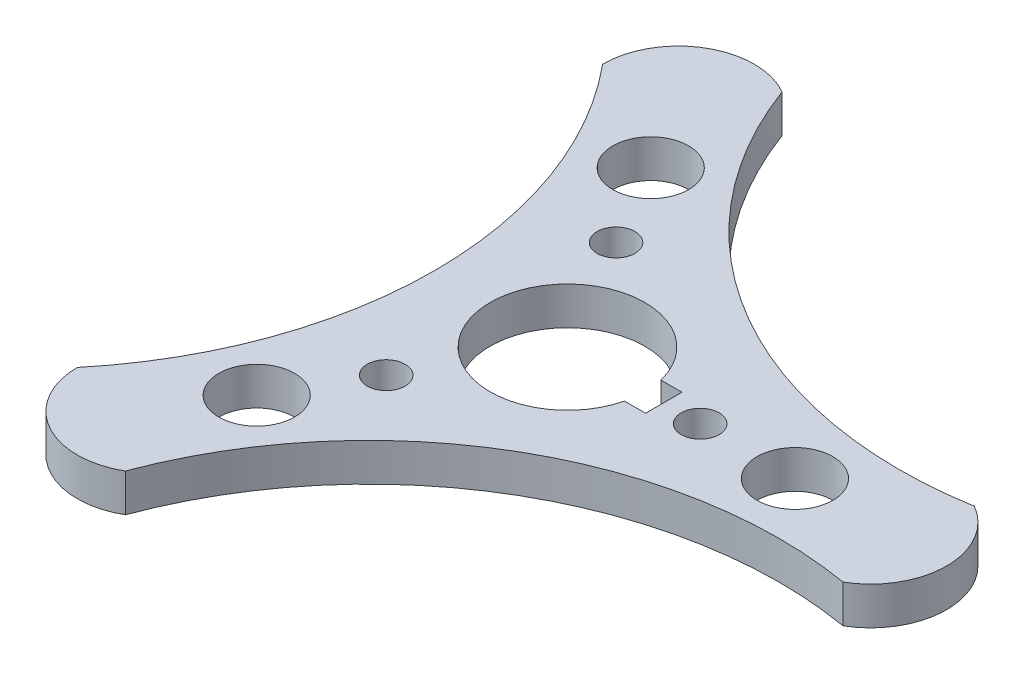
ISO-10303-21;
HEADER;
FILE_DESCRIPTION(('STEP AP214'),'2;1');
FILE_NAME('part.step','',(''),(''),'','','');
FILE_SCHEMA(('AUTOMOTIVE_DESIGN { 1 0 10303 214 1 1 1 1 }'));
ENDSEC;
DATA;
#1=APPLICATION_CONTEXT('core data for automotive mechanical design processes');
#2=APPLICATION_PROTOCOL_DEFINITION('international standard','automotive_design',2000,#1);
#3=PRODUCT_CONTEXT('',#1,'mechanical');
#4=PRODUCT('Part','Part','',(#3));
#5=PRODUCT_RELATED_PRODUCT_CATEGORY('part','',(#4));
#6=PRODUCT_DEFINITION_FORMATION('','',#4);
#7=PRODUCT_DEFINITION_CONTEXT('part definition',#1,'design');
#8=PRODUCT_DEFINITION('design','',#6,#7);
#9=PRODUCT_DEFINITION_SHAPE('','',#8);
#10=(LENGTH_UNIT() NAMED_UNIT(*) SI_UNIT(.MILLI.,.METRE.));
#11=(NAMED_UNIT(*) PLANE_ANGLE_UNIT() SI_UNIT($,.RADIAN.));
#12=(NAMED_UNIT(*) SI_UNIT($,.STERADIAN.) SOLID_ANGLE_UNIT());
#13=UNCERTAINTY_MEASURE_WITH_UNIT(LENGTH_MEASURE(1.E-05),#10,'distance_accuracy_value','');
#14=(GEOMETRIC_REPRESENTATION_CONTEXT(3) GLOBAL_UNCERTAINTY_ASSIGNED_CONTEXT((#13)) GLOBAL_UNIT_ASSIGNED_CONTEXT((#10,
#11,#12)) REPRESENTATION_CONTEXT('',''));
#15=CARTESIAN_POINT('',(0.,0.,0.));
#16=DIRECTION('',(0.,0.,1.));
#17=DIRECTION('',(1.,0.,0.));
#18=AXIS2_PLACEMENT_3D('',#15,#16,#17);
#19=CARTESIAN_POINT('',(-12.7,3.175,21.9970452561247));
#20=DIRECTION('',(0.,-1.,0.));
#21=DIRECTION('',(0.,0.,-1.));
#22=AXIS2_PLACEMENT_3D('',#19,#20,#21);
#23=CYLINDRICAL_SURFACE('',#22,6.35);
#24=CARTESIAN_POINT('',(-12.7,0.,21.9970452561247));
#25=DIRECTION('',(0.,1.,0.));
#26=DIRECTION('',(0.,0.,1.));
#27=AXIS2_PLACEMENT_3D('',#24,#25,#26);
#28=CIRCLE('',#27,6.35);
#29=CARTESIAN_POINT('',(-19.05,0.,21.9970452561247));
#30=VERTEX_POINT('',#29);
#31=CARTESIAN_POINT('',(-9.52499999999993,0.,27.4963065701559));
#32=VERTEX_POINT('',#31);
#33=EDGE_CURVE('E178',#30,#32,#28,.T.);
#34=ORIENTED_EDGE('',*,*,#33,.T.);
#35=DIRECTION('',(0.,-1.,0.));
#36=VECTOR('',#35,1.);
#37=CARTESIAN_POINT('',(-9.52499999999993,3.175,27.4963065701559));
#38=LINE('',#37,#36);
#39=CARTESIAN_POINT('',(-9.52499999999993,3.175,27.4963065701559));
#40=VERTEX_POINT('',#39);
#41=EDGE_CURVE('E11',#40,#32,#38,.T.);
#42=ORIENTED_EDGE('',*,*,#41,.F.);
#43=CARTESIAN_POINT('',(-12.7,3.175,21.9970452561247));
#44=DIRECTION('',(0.,1.,0.));
#45=DIRECTION('',(0.,0.,1.));
#46=AXIS2_PLACEMENT_3D('',#43,#44,#45);
#47=CIRCLE('',#46,6.35);
#48=CARTESIAN_POINT('',(-19.05,3.175,21.9970452561247));
#49=VERTEX_POINT('',#48);
#50=EDGE_CURVE('E306',#49,#40,#47,.T.);
#51=ORIENTED_EDGE('',*,*,#50,.F.);
#52=DIRECTION('',(0.,-1.,0.));
#53=VECTOR('',#52,1.);
#54=CARTESIAN_POINT('',(-19.05,3.175,21.9970452561247));
#55=LINE('',#54,#53);
#56=EDGE_CURVE('E51',#49,#30,#55,.T.);
#57=ORIENTED_EDGE('',*,*,#56,.T.);
#58=EDGE_LOOP('',(#34,#42,#51,#57));
#59=FACE_BOUND('',#58,.T.);
#60=ADVANCED_FACE('F32',(#59),#23,.T.);
#61=CARTESIAN_POINT('',(22.7806250000006,3.175,39.4571999281748));
#62=DIRECTION('',(0.,-1.,0.));
#63=DIRECTION('',(0.,0.,-1.));
#64=AXIS2_PLACEMENT_3D('',#61,#62,#63);
#65=CYLINDRICAL_SURFACE('',#64,34.4487500000009);
#66=CARTESIAN_POINT('',(22.7806250000006,0.,39.4571999281748));
#67=DIRECTION('',(0.,1.,0.));
#68=DIRECTION('',(0.,0.,1.));
#69=AXIS2_PLACEMENT_3D('',#66,#67,#68);
#70=CIRCLE('',#69,34.4487500000009);
#71=CARTESIAN_POINT('',(28.5749999999999,0.,5.49926131403122));
#72=VERTEX_POINT('',#71);
#73=EDGE_CURVE('E180',#32,#72,#70,.F.);
#74=ORIENTED_EDGE('',*,*,#73,.T.);
#75=DIRECTION('',(0.,-1.,0.));
#76=VECTOR('',#75,1.);
#77=CARTESIAN_POINT('',(28.5749999999999,3.175,5.49926131403122));
#78=LINE('',#77,#76);
#79=CARTESIAN_POINT('',(28.5749999999999,3.175,5.49926131403122));
#80=VERTEX_POINT('',#79);
#81=EDGE_CURVE('E42',#80,#72,#78,.T.);
#82=ORIENTED_EDGE('',*,*,#81,.F.);
#83=CARTESIAN_POINT('',(22.7806250000006,3.175,39.4571999281748));
#84=DIRECTION('',(0.,1.,0.));
#85=DIRECTION('',(0.,0.,1.));
#86=AXIS2_PLACEMENT_3D('',#83,#84,#85);
#87=CIRCLE('',#86,34.4487500000009);
#88=EDGE_CURVE('E142',#40,#80,#87,.F.);
#89=ORIENTED_EDGE('',*,*,#88,.F.);
#90=ORIENTED_EDGE('',*,*,#41,.T.);
#91=EDGE_LOOP('',(#74,#82,#89,#90));
#92=FACE_BOUND('',#91,.T.);
#93=ADVANCED_FACE('F247',(#92),#65,.F.);
#94=CARTESIAN_POINT('',(25.4,3.175,0.));
#95=DIRECTION('',(0.,-1.,0.));
#96=DIRECTION('',(0.,0.,-1.));
#97=AXIS2_PLACEMENT_3D('',#94,#95,#96);
#98=CYLINDRICAL_SURFACE('',#97,6.35);
#99=CARTESIAN_POINT('',(25.4,0.,0.));
#100=DIRECTION('',(0.,1.,0.));
#101=DIRECTION('',(0.,0.,1.));
#102=AXIS2_PLACEMENT_3D('',#99,#100,#101);
#103=CIRCLE('',#102,6.35);
#104=CARTESIAN_POINT('',(28.5749999999999,0.,-5.49926131403124));
#105=VERTEX_POINT('',#104);
#106=EDGE_CURVE('E183',#105,#72,#103,.F.);
#107=ORIENTED_EDGE('',*,*,#106,.F.);
#108=DIRECTION('',(0.,-1.,0.));
#109=VECTOR('',#108,1.);
#110=CARTESIAN_POINT('',(28.5749999999999,3.175,-5.49926131403124));
#111=LINE('',#110,#109);
#112=CARTESIAN_POINT('',(28.5749999999999,3.175,-5.49926131403124));
#113=VERTEX_POINT('',#112);
#114=EDGE_CURVE('E127',#113,#105,#111,.T.);
#115=ORIENTED_EDGE('',*,*,#114,.F.);
#116=CARTESIAN_POINT('',(25.4,3.175,0.));
#117=DIRECTION('',(0.,1.,0.));
#118=DIRECTION('',(0.,0.,1.));
#119=AXIS2_PLACEMENT_3D('',#116,#117,#118);
#120=CIRCLE('',#119,6.35);
#121=EDGE_CURVE('E140',#113,#80,#120,.F.);
#122=ORIENTED_EDGE('',*,*,#121,.T.);
#123=ORIENTED_EDGE('',*,*,#81,.T.);
#124=EDGE_LOOP('',(#107,#115,#122,#123));
#125=FACE_BOUND('',#124,.T.);
#126=ADVANCED_FACE('F252',(#125),#98,.T.);
#127=CARTESIAN_POINT('',(22.7806250000005,3.175,-39.4571999281746));
#128=DIRECTION('',(0.,-1.,0.));
#129=DIRECTION('',(0.,0.,-1.));
#130=AXIS2_PLACEMENT_3D('',#127,#128,#129);
#131=CYLINDRICAL_SURFACE('',#130,34.4487500000007);
#132=CARTESIAN_POINT('',(22.7806250000005,0.,-39.4571999281746));
#133=DIRECTION('',(0.,1.,0.));
#134=DIRECTION('',(0.,0.,1.));
#135=AXIS2_PLACEMENT_3D('',#132,#133,#134);
#136=CIRCLE('',#135,34.4487500000007);
#137=CARTESIAN_POINT('',(-9.52499999999993,0.,-27.4963065701559));
#138=VERTEX_POINT('',#137);
#139=EDGE_CURVE('E124',#138,#105,#136,.T.);
#140=ORIENTED_EDGE('',*,*,#139,.F.);
#141=DIRECTION('',(0.,-1.,0.));
#142=VECTOR('',#141,1.);
#143=CARTESIAN_POINT('',(-9.52499999999993,3.175,-27.4963065701559));
#144=LINE('',#143,#142);
#145=CARTESIAN_POINT('',(-9.52499999999993,3.175,-27.4963065701559));
#146=VERTEX_POINT('',#145);
#147=EDGE_CURVE('E118',#146,#138,#144,.T.);
#148=ORIENTED_EDGE('',*,*,#147,.F.);
#149=CARTESIAN_POINT('',(22.7806250000005,3.175,-39.4571999281746));
#150=DIRECTION('',(0.,1.,0.));
#151=DIRECTION('',(0.,0.,1.));
#152=AXIS2_PLACEMENT_3D('',#149,#150,#151);
#153=CIRCLE('',#152,34.4487500000007);
#154=EDGE_CURVE('E122',#146,#113,#153,.T.);
#155=ORIENTED_EDGE('',*,*,#154,.T.);
#156=ORIENTED_EDGE('',*,*,#114,.T.);
#157=EDGE_LOOP('',(#140,#148,#155,#156));
#158=FACE_BOUND('',#157,.T.);
#159=ADVANCED_FACE('F120',(#158),#131,.F.);
#160=CARTESIAN_POINT('',(-12.7,3.175,-21.9970452561248));
#161=DIRECTION('',(0.,-1.,0.));
#162=DIRECTION('',(0.,0.,-1.));
#163=AXIS2_PLACEMENT_3D('',#160,#161,#162);
#164=CYLINDRICAL_SURFACE('',#163,6.35);
#165=CARTESIAN_POINT('',(-12.7,0.,-21.9970452561248));
#166=DIRECTION('',(0.,1.,0.));
#167=DIRECTION('',(0.,0.,1.));
#168=AXIS2_PLACEMENT_3D('',#165,#166,#167);
#169=CIRCLE('',#168,6.35);
#170=CARTESIAN_POINT('',(-19.05,0.,-21.9970452561247));
#171=VERTEX_POINT('',#170);
#172=EDGE_CURVE('E187',#138,#171,#169,.T.);
#173=ORIENTED_EDGE('',*,*,#172,.T.);
#174=DIRECTION('',(0.,-1.,0.));
#175=VECTOR('',#174,1.);
#176=CARTESIAN_POINT('',(-19.05,3.175,-21.9970452561247));
#177=LINE('',#176,#175);
#178=CARTESIAN_POINT('',(-19.05,3.175,-21.9970452561247));
#179=VERTEX_POINT('',#178);
#180=EDGE_CURVE('E84',#179,#171,#177,.T.);
#181=ORIENTED_EDGE('',*,*,#180,.F.);
#182=CARTESIAN_POINT('',(-12.7,3.175,-21.9970452561248));
#183=DIRECTION('',(0.,1.,0.));
#184=DIRECTION('',(0.,0.,1.));
#185=AXIS2_PLACEMENT_3D('',#182,#183,#184);
#186=CIRCLE('',#185,6.35);
#187=EDGE_CURVE('E129',#146,#179,#186,.T.);
#188=ORIENTED_EDGE('',*,*,#187,.F.);
#189=ORIENTED_EDGE('',*,*,#147,.T.);
#190=EDGE_LOOP('',(#173,#181,#188,#189));
#191=FACE_BOUND('',#190,.T.);
#192=ADVANCED_FACE('F130',(#191),#164,.T.);
#193=CARTESIAN_POINT('',(0.,3.175,0.));
#194=DIRECTION('',(0.,-1.,0.));
#195=DIRECTION('',(0.,0.,-1.));
#196=AXIS2_PLACEMENT_3D('',#193,#194,#195);
#197=CYLINDRICAL_SURFACE('',#196,6.48020383174085);
#198=CARTESIAN_POINT('',(0.,0.,0.));
#199=DIRECTION('',(0.,1.,0.));
#200=DIRECTION('',(0.,0.,1.));
#201=AXIS2_PLACEMENT_3D('',#198,#199,#200);
#202=CIRCLE('',#201,6.48020383174085);
#203=CARTESIAN_POINT('',(6.29864404283197,0.,-1.52319562847524));
#204=VERTEX_POINT('',#203);
#205=CARTESIAN_POINT('',(6.29864404283197,0.,1.52319562847524));
#206=VERTEX_POINT('',#205);
#207=EDGE_CURVE('E163',#204,#206,#202,.T.);
#208=ORIENTED_EDGE('',*,*,#207,.F.);
#209=DIRECTION('',(0.,-1.,0.));
#210=VECTOR('',#209,1.);
#211=CARTESIAN_POINT('',(6.29864404283197,3.175,-1.52319562847524));
#212=LINE('',#211,#210);
#213=CARTESIAN_POINT('',(6.29864404283197,3.175,-1.52319562847524));
#214=VERTEX_POINT('',#213);
#215=EDGE_CURVE('E36',#214,#204,#212,.T.);
#216=ORIENTED_EDGE('',*,*,#215,.F.);
#217=CARTESIAN_POINT('',(0.,3.175,0.));
#218=DIRECTION('',(0.,1.,0.));
#219=DIRECTION('',(0.,0.,1.));
#220=AXIS2_PLACEMENT_3D('',#217,#218,#219);
#221=CIRCLE('',#220,6.48020383174085);
#222=CARTESIAN_POINT('',(6.29864404283197,3.175,1.52319562847524));
#223=VERTEX_POINT('',#222);
#224=EDGE_CURVE('E226',#214,#223,#221,.T.);
#225=ORIENTED_EDGE('',*,*,#224,.T.);
#226=DIRECTION('',(0.,-1.,0.));
#227=VECTOR('',#226,1.);
#228=CARTESIAN_POINT('',(6.29864404283197,3.175,1.52319562847524));
#229=LINE('',#228,#227);
#230=EDGE_CURVE('E159',#223,#206,#229,.T.);
#231=ORIENTED_EDGE('',*,*,#230,.T.);
#232=EDGE_LOOP('',(#208,#216,#225,#231));
#233=FACE_BOUND('',#232,.T.);
#234=ADVANCED_FACE('F225',(#233),#197,.F.);
#235=CARTESIAN_POINT('',(0.,3.175,-1.52319562847524));
#236=DIRECTION('',(0.,0.,-1.));
#237=DIRECTION('',(-1.,0.,0.));
#238=AXIS2_PLACEMENT_3D('',#235,#236,#237);
#239=PLANE('',#238);
#240=DIRECTION('',(1.,0.,0.));
#241=VECTOR('',#240,1.);
#242=CARTESIAN_POINT('',(0.,0.,-1.52319562847524));
#243=LINE('',#242,#241);
#244=CARTESIAN_POINT('',(8.06581965816466,0.,-1.52319562847524));
#245=VERTEX_POINT('',#244);
#246=EDGE_CURVE('E166',#204,#245,#243,.T.);
#247=ORIENTED_EDGE('',*,*,#246,.T.);
#248=DIRECTION('',(0.,-1.,0.));
#249=VECTOR('',#248,1.);
#250=CARTESIAN_POINT('',(8.06581965816466,3.175,-1.52319562847524));
#251=LINE('',#250,#249);
#252=CARTESIAN_POINT('',(8.06581965816466,3.175,-1.52319562847524));
#253=VERTEX_POINT('',#252);
#254=EDGE_CURVE('E211',#253,#245,#251,.T.);
#255=ORIENTED_EDGE('',*,*,#254,.F.);
#256=DIRECTION('',(1.,0.,0.));
#257=VECTOR('',#256,1.);
#258=CARTESIAN_POINT('',(0.,3.175,-1.52319562847524));
#259=LINE('',#258,#257);
#260=EDGE_CURVE('E219',#214,#253,#259,.T.);
#261=ORIENTED_EDGE('',*,*,#260,.F.);
#262=ORIENTED_EDGE('',*,*,#215,.T.);
#263=EDGE_LOOP('',(#247,#255,#261,#262));
#264=FACE_BOUND('',#263,.T.);
#265=ADVANCED_FACE('F217',(#264),#239,.F.);
#266=CARTESIAN_POINT('',(8.06581965816466,3.175,0.));
#267=DIRECTION('',(1.,0.,0.));
#268=DIRECTION('',(0.,0.,-1.));
#269=AXIS2_PLACEMENT_3D('',#266,#267,#268);
#270=PLANE('',#269);
#271=DIRECTION('',(0.,0.,1.));
#272=VECTOR('',#271,1.);
#273=CARTESIAN_POINT('',(8.06581965816466,0.,0.));
#274=LINE('',#273,#272);
#275=CARTESIAN_POINT('',(8.06581965816466,0.,1.52319562847524));
#276=VERTEX_POINT('',#275);
#277=EDGE_CURVE('E169',#245,#276,#274,.T.);
#278=ORIENTED_EDGE('',*,*,#277,.T.);
#279=DIRECTION('',(0.,-1.,0.));
#280=VECTOR('',#279,1.);
#281=CARTESIAN_POINT('',(8.06581965816466,3.175,1.52319562847524));
#282=LINE('',#281,#280);
#283=CARTESIAN_POINT('',(8.06581965816466,3.175,1.52319562847524));
#284=VERTEX_POINT('',#283);
#285=EDGE_CURVE('E210',#284,#276,#282,.T.);
#286=ORIENTED_EDGE('',*,*,#285,.F.);
#287=DIRECTION('',(0.,0.,1.));
#288=VECTOR('',#287,1.);
#289=CARTESIAN_POINT('',(8.06581965816466,3.175,0.));
#290=LINE('',#289,#288);
#291=EDGE_CURVE('E313',#253,#284,#290,.T.);
#292=ORIENTED_EDGE('',*,*,#291,.F.);
#293=ORIENTED_EDGE('',*,*,#254,.T.);
#294=EDGE_LOOP('',(#278,#286,#292,#293));
#295=FACE_BOUND('',#294,.T.);
#296=ADVANCED_FACE('F233',(#295),#270,.F.);
#297=CARTESIAN_POINT('',(19.0500000000005,3.175,0.));
#298=DIRECTION('',(0.,-1.,0.));
#299=DIRECTION('',(0.,0.,-1.));
#300=AXIS2_PLACEMENT_3D('',#297,#298,#299);
#301=CYLINDRICAL_SURFACE('',#300,3.175);
#302=CARTESIAN_POINT('',(19.0500000000005,3.175,0.));
#303=DIRECTION('',(0.,1.,0.));
#304=DIRECTION('',(0.,0.,1.));
#305=AXIS2_PLACEMENT_3D('',#302,#303,#304);
#306=CIRCLE('',#305,3.175);
#307=CARTESIAN_POINT('',(19.0500000000005,3.175,3.17500000000001));
#308=VERTEX_POINT('',#307);
#309=EDGE_CURVE('E153',#308,#308,#306,.T.);
#310=ORIENTED_EDGE('',*,*,#309,.T.);
#311=EDGE_LOOP('',(#310));
#312=FACE_BOUND('',#311,.T.);
#313=CARTESIAN_POINT('',(19.0500000000005,0.,0.));
#314=DIRECTION('',(0.,1.,0.));
#315=DIRECTION('',(0.,0.,1.));
#316=AXIS2_PLACEMENT_3D('',#313,#314,#315);
#317=CIRCLE('',#316,3.175);
#318=CARTESIAN_POINT('',(19.0500000000005,0.,3.17500000000001));
#319=VERTEX_POINT('',#318);
#320=EDGE_CURVE('E198',#319,#319,#317,.T.);
#321=ORIENTED_EDGE('',*,*,#320,.F.);
#322=EDGE_LOOP('',(#321));
#323=FACE_BOUND('',#322,.T.);
#324=ADVANCED_FACE('F235',(#312,#323),#301,.F.);
#325=CARTESIAN_POINT('',(-9.52500000000023,3.175,-16.497783942094));
#326=DIRECTION('',(0.,-1.,0.));
#327=DIRECTION('',(0.,0.,-1.));
#328=AXIS2_PLACEMENT_3D('',#325,#326,#327);
#329=CYLINDRICAL_SURFACE('',#328,3.175);
#330=CARTESIAN_POINT('',(-9.52500000000023,3.175,-16.497783942094));
#331=DIRECTION('',(0.,1.,0.));
#332=DIRECTION('',(0.,0.,1.));
#333=AXIS2_PLACEMENT_3D('',#330,#331,#332);
#334=CIRCLE('',#333,3.175);
#335=CARTESIAN_POINT('',(-9.52500000000023,3.175,-13.322783942094));
#336=VERTEX_POINT('',#335);
#337=EDGE_CURVE('E150',#336,#336,#334,.T.);
#338=ORIENTED_EDGE('',*,*,#337,.T.);
#339=EDGE_LOOP('',(#338));
#340=FACE_BOUND('',#339,.T.);
#341=CARTESIAN_POINT('',(-9.52500000000023,0.,-16.497783942094));
#342=DIRECTION('',(0.,1.,0.));
#343=DIRECTION('',(0.,0.,1.));
#344=AXIS2_PLACEMENT_3D('',#341,#342,#343);
#345=CIRCLE('',#344,3.175);
#346=CARTESIAN_POINT('',(-9.52500000000023,0.,-13.322783942094));
#347=VERTEX_POINT('',#346);
#348=EDGE_CURVE('E195',#347,#347,#345,.T.);
#349=ORIENTED_EDGE('',*,*,#348,.F.);
#350=EDGE_LOOP('',(#349));
#351=FACE_BOUND('',#350,.T.);
#352=ADVANCED_FACE('F241',(#340,#351),#329,.F.);
#353=CARTESIAN_POINT('',(-9.52500000000024,3.175,16.497783942094));
#354=DIRECTION('',(0.,-1.,0.));
#355=DIRECTION('',(0.,0.,-1.));
#356=AXIS2_PLACEMENT_3D('',#353,#354,#355);
#357=CYLINDRICAL_SURFACE('',#356,3.175);
#358=CARTESIAN_POINT('',(-9.52500000000024,3.175,16.497783942094));
#359=DIRECTION('',(0.,1.,0.));
#360=DIRECTION('',(0.,0.,1.));
#361=AXIS2_PLACEMENT_3D('',#358,#359,#360);
#362=CIRCLE('',#361,3.175);
#363=CARTESIAN_POINT('',(-9.52500000000024,3.175,19.672783942094));
#364=VERTEX_POINT('',#363);
#365=EDGE_CURVE('E147',#364,#364,#362,.T.);
#366=ORIENTED_EDGE('',*,*,#365,.T.);
#367=EDGE_LOOP('',(#366));
#368=FACE_BOUND('',#367,.T.);
#369=CARTESIAN_POINT('',(-9.52500000000024,0.,16.497783942094));
#370=DIRECTION('',(0.,1.,0.));
#371=DIRECTION('',(0.,0.,1.));
#372=AXIS2_PLACEMENT_3D('',#369,#370,#371);
#373=CIRCLE('',#372,3.175);
#374=CARTESIAN_POINT('',(-9.52500000000024,0.,19.672783942094));
#375=VERTEX_POINT('',#374);
#376=EDGE_CURVE('E192',#375,#375,#373,.T.);
#377=ORIENTED_EDGE('',*,*,#376,.F.);
#378=EDGE_LOOP('',(#377));
#379=FACE_BOUND('',#378,.T.);
#380=ADVANCED_FACE('F287',(#368,#379),#357,.F.);
#381=CARTESIAN_POINT('',(-45.561250000001,3.175,0.));
#382=DIRECTION('',(0.,-1.,0.));
#383=DIRECTION('',(0.,0.,-1.));
#384=AXIS2_PLACEMENT_3D('',#381,#382,#383);
#385=CYLINDRICAL_SURFACE('',#384,34.4487500000007);
#386=CARTESIAN_POINT('',(-45.561250000001,0.,0.));
#387=DIRECTION('',(0.,1.,0.));
#388=DIRECTION('',(0.,0.,1.));
#389=AXIS2_PLACEMENT_3D('',#386,#387,#388);
#390=CIRCLE('',#389,34.4487500000007);
#391=EDGE_CURVE('E189',#30,#171,#390,.T.);
#392=ORIENTED_EDGE('',*,*,#391,.F.);
#393=ORIENTED_EDGE('',*,*,#56,.F.);
#394=CARTESIAN_POINT('',(-45.561250000001,3.175,0.));
#395=DIRECTION('',(0.,1.,0.));
#396=DIRECTION('',(0.,0.,1.));
#397=AXIS2_PLACEMENT_3D('',#394,#395,#396);
#398=CIRCLE('',#397,34.4487500000007);
#399=EDGE_CURVE('E133',#49,#179,#398,.T.);
#400=ORIENTED_EDGE('',*,*,#399,.T.);
#401=ORIENTED_EDGE('',*,*,#180,.T.);
#402=EDGE_LOOP('',(#392,#393,#400,#401));
#403=FACE_BOUND('',#402,.T.);
#404=ADVANCED_FACE('F259',(#403),#385,.F.);
#405=CARTESIAN_POINT('',(-5.55625000000014,3.175,-9.62370729955481));
#406=DIRECTION('',(0.,-1.,0.));
#407=DIRECTION('',(0.,0.,-1.));
#408=AXIS2_PLACEMENT_3D('',#405,#406,#407);
#409=CYLINDRICAL_SURFACE('',#408,1.5875);
#410=CARTESIAN_POINT('',(-5.55625000000014,3.175,-9.62370729955481));
#411=DIRECTION('',(0.,1.,0.));
#412=DIRECTION('',(0.,0.,1.));
#413=AXIS2_PLACEMENT_3D('',#410,#411,#412);
#414=CIRCLE('',#413,1.5875);
#415=CARTESIAN_POINT('',(-5.55625000000014,3.175,-8.03620729955481));
#416=VERTEX_POINT('',#415);
#417=EDGE_CURVE('E307',#416,#416,#414,.T.);
#418=ORIENTED_EDGE('',*,*,#417,.T.);
#419=EDGE_LOOP('',(#418));
#420=FACE_BOUND('',#419,.T.);
#421=CARTESIAN_POINT('',(-5.55625000000014,0.,-9.62370729955481));
#422=DIRECTION('',(0.,1.,0.));
#423=DIRECTION('',(0.,0.,1.));
#424=AXIS2_PLACEMENT_3D('',#421,#422,#423);
#425=CIRCLE('',#424,1.5875);
#426=CARTESIAN_POINT('',(-5.55625000000014,0.,-8.03620729955481));
#427=VERTEX_POINT('',#426);
#428=EDGE_CURVE('E175',#427,#427,#425,.T.);
#429=ORIENTED_EDGE('',*,*,#428,.F.);
#430=EDGE_LOOP('',(#429));
#431=FACE_BOUND('',#430,.T.);
#432=ADVANCED_FACE('F257',(#420,#431),#409,.F.);
#433=CARTESIAN_POINT('',(0.,3.175,1.52319562847524));
#434=DIRECTION('',(0.,0.,-1.));
#435=DIRECTION('',(-1.,0.,0.));
#436=AXIS2_PLACEMENT_3D('',#433,#434,#435);
#437=PLANE('',#436);
#438=DIRECTION('',(1.,0.,0.));
#439=VECTOR('',#438,1.);
#440=CARTESIAN_POINT('',(0.,0.,1.52319562847524));
#441=LINE('',#440,#439);
#442=EDGE_CURVE('E172',#206,#276,#441,.T.);
#443=ORIENTED_EDGE('',*,*,#442,.F.);
#444=ORIENTED_EDGE('',*,*,#230,.F.);
#445=DIRECTION('',(1.,0.,0.));
#446=VECTOR('',#445,1.);
#447=CARTESIAN_POINT('',(0.,3.175,1.52319562847524));
#448=LINE('',#447,#446);
#449=EDGE_CURVE('E231',#223,#284,#448,.T.);
#450=ORIENTED_EDGE('',*,*,#449,.T.);
#451=ORIENTED_EDGE('',*,*,#285,.T.);
#452=EDGE_LOOP('',(#443,#444,#450,#451));
#453=FACE_BOUND('',#452,.T.);
#454=ADVANCED_FACE('F230',(#453),#437,.T.);
#455=CARTESIAN_POINT('',(-5.55625000000014,3.175,9.6237072995548));
#456=DIRECTION('',(0.,-1.,0.));
#457=DIRECTION('',(0.,0.,-1.));
#458=AXIS2_PLACEMENT_3D('',#455,#456,#457);
#459=CYLINDRICAL_SURFACE('',#458,1.5875);
#460=CARTESIAN_POINT('',(-5.55625000000014,3.175,9.6237072995548));
#461=DIRECTION('',(0.,1.,0.));
#462=DIRECTION('',(0.,0.,1.));
#463=AXIS2_PLACEMENT_3D('',#460,#461,#462);
#464=CIRCLE('',#463,1.5875);
#465=CARTESIAN_POINT('',(-5.55625000000014,3.175,11.2112072995548));
#466=VERTEX_POINT('',#465);
#467=EDGE_CURVE('E204',#466,#466,#464,.T.);
#468=ORIENTED_EDGE('',*,*,#467,.T.);
#469=EDGE_LOOP('',(#468));
#470=FACE_BOUND('',#469,.T.);
#471=CARTESIAN_POINT('',(-5.55625000000014,0.,9.6237072995548));
#472=DIRECTION('',(0.,1.,0.));
#473=DIRECTION('',(0.,0.,1.));
#474=AXIS2_PLACEMENT_3D('',#471,#472,#473);
#475=CIRCLE('',#474,1.5875);
#476=CARTESIAN_POINT('',(-5.55625000000014,0.,11.2112072995548));
#477=VERTEX_POINT('',#476);
#478=EDGE_CURVE('E160',#477,#477,#475,.T.);
#479=ORIENTED_EDGE('',*,*,#478,.F.);
#480=EDGE_LOOP('',(#479));
#481=FACE_BOUND('',#480,.T.);
#482=ADVANCED_FACE('F34',(#470,#481),#459,.F.);
#483=CARTESIAN_POINT('',(11.1125000000003,3.175,0.));
#484=DIRECTION('',(0.,-1.,0.));
#485=DIRECTION('',(0.,0.,-1.));
#486=AXIS2_PLACEMENT_3D('',#483,#484,#485);
#487=CYLINDRICAL_SURFACE('',#486,1.5875);
#488=CARTESIAN_POINT('',(11.1125000000003,3.175,0.));
#489=DIRECTION('',(0.,1.,0.));
#490=DIRECTION('',(0.,0.,1.));
#491=AXIS2_PLACEMENT_3D('',#488,#489,#490);
#492=CIRCLE('',#491,1.5875);
#493=CARTESIAN_POINT('',(11.1125000000003,3.175,1.5875));
#494=VERTEX_POINT('',#493);
#495=EDGE_CURVE('E156',#494,#494,#492,.T.);
#496=ORIENTED_EDGE('',*,*,#495,.T.);
#497=EDGE_LOOP('',(#496));
#498=FACE_BOUND('',#497,.T.);
#499=CARTESIAN_POINT('',(11.1125000000003,0.,0.));
#500=DIRECTION('',(0.,1.,0.));
#501=DIRECTION('',(0.,0.,1.));
#502=AXIS2_PLACEMENT_3D('',#499,#500,#501);
#503=CIRCLE('',#502,1.5875);
#504=CARTESIAN_POINT('',(11.1125000000003,0.,1.5875));
#505=VERTEX_POINT('',#504);
#506=EDGE_CURVE('E201',#505,#505,#503,.T.);
#507=ORIENTED_EDGE('',*,*,#506,.F.);
#508=EDGE_LOOP('',(#507));
#509=FACE_BOUND('',#508,.T.);
#510=ADVANCED_FACE('F265',(#498,#509),#487,.F.);
#511=CARTESIAN_POINT('',(0.,3.175,0.));
#512=DIRECTION('',(0.,1.,0.));
#513=DIRECTION('',(0.,0.,1.));
#514=AXIS2_PLACEMENT_3D('',#511,#512,#513);
#515=PLANE('',#514);
#516=ORIENTED_EDGE('',*,*,#467,.F.);
#517=EDGE_LOOP('',(#516));
#518=FACE_BOUND('',#517,.T.);
#519=ORIENTED_EDGE('',*,*,#224,.F.);
#520=ORIENTED_EDGE('',*,*,#260,.T.);
#521=ORIENTED_EDGE('',*,*,#291,.T.);
#522=ORIENTED_EDGE('',*,*,#449,.F.);
#523=EDGE_LOOP('',(#519,#520,#521,#522));
#524=FACE_BOUND('',#523,.T.);
#525=ORIENTED_EDGE('',*,*,#417,.F.);
#526=EDGE_LOOP('',(#525));
#527=FACE_BOUND('',#526,.T.);
#528=ORIENTED_EDGE('',*,*,#50,.T.);
#529=ORIENTED_EDGE('',*,*,#88,.T.);
#530=ORIENTED_EDGE('',*,*,#121,.F.);
#531=ORIENTED_EDGE('',*,*,#154,.F.);
#532=ORIENTED_EDGE('',*,*,#187,.T.);
#533=ORIENTED_EDGE('',*,*,#399,.F.);
#534=EDGE_LOOP('',(#528,#529,#530,#531,#532,#533));
#535=FACE_BOUND('',#534,.T.);
#536=ORIENTED_EDGE('',*,*,#365,.F.);
#537=EDGE_LOOP('',(#536));
#538=FACE_BOUND('',#537,.T.);
#539=ORIENTED_EDGE('',*,*,#337,.F.);
#540=EDGE_LOOP('',(#539));
#541=FACE_BOUND('',#540,.T.);
#542=ORIENTED_EDGE('',*,*,#309,.F.);
#543=EDGE_LOOP('',(#542));
#544=FACE_BOUND('',#543,.T.);
#545=ORIENTED_EDGE('',*,*,#495,.F.);
#546=EDGE_LOOP('',(#545));
#547=FACE_BOUND('',#546,.T.);
#548=ADVANCED_FACE('F137',(#518,#524,#527,#535,#538,#541,#544,#547),#515,.T.);
#549=CARTESIAN_POINT('',(0.,0.,0.));
#550=DIRECTION('',(0.,1.,0.));
#551=DIRECTION('',(0.,0.,1.));
#552=AXIS2_PLACEMENT_3D('',#549,#550,#551);
#553=PLANE('',#552);
#554=ORIENTED_EDGE('',*,*,#478,.T.);
#555=EDGE_LOOP('',(#554));
#556=FACE_BOUND('',#555,.T.);
#557=ORIENTED_EDGE('',*,*,#207,.T.);
#558=ORIENTED_EDGE('',*,*,#442,.T.);
#559=ORIENTED_EDGE('',*,*,#277,.F.);
#560=ORIENTED_EDGE('',*,*,#246,.F.);
#561=EDGE_LOOP('',(#557,#558,#559,#560));
#562=FACE_BOUND('',#561,.T.);
#563=ORIENTED_EDGE('',*,*,#428,.T.);
#564=EDGE_LOOP('',(#563));
#565=FACE_BOUND('',#564,.T.);
#566=ORIENTED_EDGE('',*,*,#33,.F.);
#567=ORIENTED_EDGE('',*,*,#391,.T.);
#568=ORIENTED_EDGE('',*,*,#172,.F.);
#569=ORIENTED_EDGE('',*,*,#139,.T.);
#570=ORIENTED_EDGE('',*,*,#106,.T.);
#571=ORIENTED_EDGE('',*,*,#73,.F.);
#572=EDGE_LOOP('',(#566,#567,#568,#569,#570,#571));
#573=FACE_BOUND('',#572,.T.);
#574=ORIENTED_EDGE('',*,*,#376,.T.);
#575=EDGE_LOOP('',(#574));
#576=FACE_BOUND('',#575,.T.);
#577=ORIENTED_EDGE('',*,*,#348,.T.);
#578=EDGE_LOOP('',(#577));
#579=FACE_BOUND('',#578,.T.);
#580=ORIENTED_EDGE('',*,*,#320,.T.);
#581=EDGE_LOOP('',(#580));
#582=FACE_BOUND('',#581,.T.);
#583=ORIENTED_EDGE('',*,*,#506,.T.);
#584=EDGE_LOOP('',(#583));
#585=FACE_BOUND('',#584,.T.);
#586=ADVANCED_FACE('F222',(#556,#562,#565,#573,#576,#579,#582,#585),#553,.F.);
#587=CLOSED_SHELL('',(#60,#93,#126,#159,#192,#234,#265,#296,#324,#352,#380,#404,#432,#454,#482,
#510,#548,#586));
#588=MANIFOLD_SOLID_BREP('B2',#587);
#589=ADVANCED_BREP_SHAPE_REPRESENTATION('',(#18,#588),#14);
#590=SHAPE_DEFINITION_REPRESENTATION(#9,#589);
ENDSEC;
END-ISO-10303-21;
